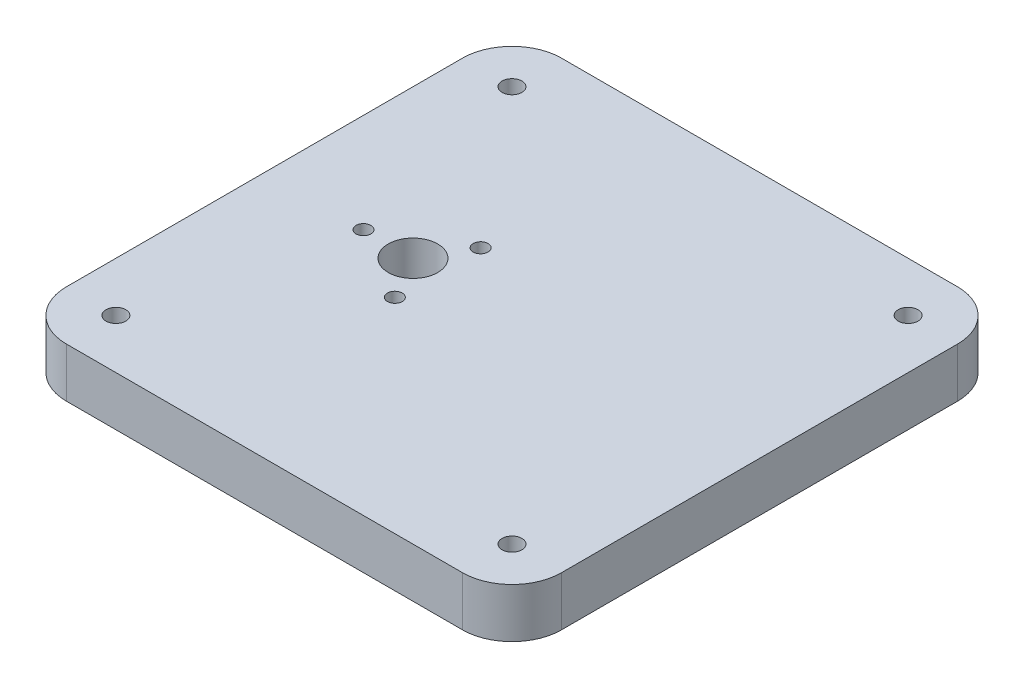
ISO-10303-21;
HEADER;
FILE_DESCRIPTION(('STEP AP214'),'2;1');
FILE_NAME('part.step','',(''),(''),'','','');
FILE_SCHEMA(('AUTOMOTIVE_DESIGN { 1 0 10303 214 1 1 1 1 }'));
ENDSEC;
DATA;
#1=APPLICATION_CONTEXT('core data for automotive mechanical design processes');
#2=APPLICATION_PROTOCOL_DEFINITION('international standard','automotive_design',2000,#1);
#3=PRODUCT_CONTEXT('',#1,'mechanical');
#4=PRODUCT('Part','Part','',(#3));
#5=PRODUCT_RELATED_PRODUCT_CATEGORY('part','',(#4));
#6=PRODUCT_DEFINITION_FORMATION('','',#4);
#7=PRODUCT_DEFINITION_CONTEXT('part definition',#1,'design');
#8=PRODUCT_DEFINITION('design','',#6,#7);
#9=PRODUCT_DEFINITION_SHAPE('','',#8);
#10=(LENGTH_UNIT() NAMED_UNIT(*) SI_UNIT(.MILLI.,.METRE.));
#11=(NAMED_UNIT(*) PLANE_ANGLE_UNIT() SI_UNIT($,.RADIAN.));
#12=(NAMED_UNIT(*) SI_UNIT($,.STERADIAN.) SOLID_ANGLE_UNIT());
#13=UNCERTAINTY_MEASURE_WITH_UNIT(LENGTH_MEASURE(1.E-05),#10,'distance_accuracy_value','');
#14=(GEOMETRIC_REPRESENTATION_CONTEXT(3) GLOBAL_UNCERTAINTY_ASSIGNED_CONTEXT((#13)) GLOBAL_UNIT_ASSIGNED_CONTEXT((#10,
#11,#12)) REPRESENTATION_CONTEXT('',''));
#15=CARTESIAN_POINT('',(0.,0.,0.));
#16=DIRECTION('',(0.,0.,1.));
#17=DIRECTION('',(1.,0.,0.));
#18=AXIS2_PLACEMENT_3D('',#15,#16,#17);
#19=CARTESIAN_POINT('',(-50.9375,10.,-24.9609375));
#20=DIRECTION('',(0.,-1.,0.));
#21=DIRECTION('',(0.,0.,-1.));
#22=AXIS2_PLACEMENT_3D('',#19,#20,#21);
#23=PLANE('',#22);
#24=CARTESIAN_POINT('',(-50.9375,10.,-24.9609375));
#25=DIRECTION('',(0.,1.,0.));
#26=DIRECTION('',(0.,0.,-1.));
#27=AXIS2_PLACEMENT_3D('',#24,#25,#26);
#28=CIRCLE('',#27,10.);
#29=CARTESIAN_POINT('',(-50.9375,10.,-34.9609375));
#30=VERTEX_POINT('',#29);
#31=CARTESIAN_POINT('',(-60.9375,10.,-24.9609375));
#32=VERTEX_POINT('',#31);
#33=EDGE_CURVE('E164',#30,#32,#28,.T.);
#34=ORIENTED_EDGE('',*,*,#33,.T.);
#35=DIRECTION('',(0.,0.,1.));
#36=VECTOR('',#35,1.);
#37=CARTESIAN_POINT('',(-60.9375,10.,-24.9609375));
#38=LINE('',#37,#36);
#39=CARTESIAN_POINT('',(-60.9375,10.,55.0390625));
#40=VERTEX_POINT('',#39);
#41=EDGE_CURVE('E100',#32,#40,#38,.T.);
#42=ORIENTED_EDGE('',*,*,#41,.T.);
#43=CARTESIAN_POINT('',(-50.9375,10.,55.0390625));
#44=DIRECTION('',(0.,1.,0.));
#45=DIRECTION('',(0.,0.,1.));
#46=AXIS2_PLACEMENT_3D('',#43,#44,#45);
#47=CIRCLE('',#46,10.);
#48=CARTESIAN_POINT('',(-50.9375,10.,65.0390625));
#49=VERTEX_POINT('',#48);
#50=EDGE_CURVE('E185',#40,#49,#47,.T.);
#51=ORIENTED_EDGE('',*,*,#50,.T.);
#52=DIRECTION('',(1.,0.,0.));
#53=VECTOR('',#52,1.);
#54=CARTESIAN_POINT('',(-50.9374999999999,10.,65.0390625));
#55=LINE('',#54,#53);
#56=CARTESIAN_POINT('',(29.0624999999999,10.,65.0390625));
#57=VERTEX_POINT('',#56);
#58=EDGE_CURVE('E199',#49,#57,#55,.T.);
#59=ORIENTED_EDGE('',*,*,#58,.T.);
#60=CARTESIAN_POINT('',(29.0625,10.,55.0390625));
#61=DIRECTION('',(0.,1.,0.));
#62=DIRECTION('',(0.,0.,1.));
#63=AXIS2_PLACEMENT_3D('',#60,#61,#62);
#64=CIRCLE('',#63,10.);
#65=CARTESIAN_POINT('',(39.0625,10.,55.0390625));
#66=VERTEX_POINT('',#65);
#67=EDGE_CURVE('E119',#57,#66,#64,.T.);
#68=ORIENTED_EDGE('',*,*,#67,.T.);
#69=DIRECTION('',(0.,0.,-1.));
#70=VECTOR('',#69,1.);
#71=CARTESIAN_POINT('',(39.0625,10.,-24.9609375));
#72=LINE('',#71,#70);
#73=CARTESIAN_POINT('',(39.0625,10.,-24.9609375));
#74=VERTEX_POINT('',#73);
#75=EDGE_CURVE('E113',#66,#74,#72,.T.);
#76=ORIENTED_EDGE('',*,*,#75,.T.);
#77=CARTESIAN_POINT('',(29.0625,10.,-24.9609375));
#78=DIRECTION('',(0.,1.,0.));
#79=DIRECTION('',(0.,0.,-1.));
#80=AXIS2_PLACEMENT_3D('',#77,#78,#79);
#81=CIRCLE('',#80,10.);
#82=CARTESIAN_POINT('',(29.0624999999999,10.,-34.9609375));
#83=VERTEX_POINT('',#82);
#84=EDGE_CURVE('E117',#74,#83,#81,.T.);
#85=ORIENTED_EDGE('',*,*,#84,.T.);
#86=DIRECTION('',(-1.,0.,0.));
#87=VECTOR('',#86,1.);
#88=CARTESIAN_POINT('',(-50.9375,10.,-34.9609375));
#89=LINE('',#88,#87);
#90=EDGE_CURVE('E57',#83,#30,#89,.T.);
#91=ORIENTED_EDGE('',*,*,#90,.T.);
#92=EDGE_LOOP('',(#34,#42,#51,#59,#68,#76,#85,#91));
#93=FACE_BOUND('',#92,.T.);
#94=CARTESIAN_POINT('',(-50.9375,10.,-24.9609375));
#95=DIRECTION('',(0.,1.,0.));
#96=DIRECTION('',(0.,0.,1.));
#97=AXIS2_PLACEMENT_3D('',#94,#95,#96);
#98=CIRCLE('',#97,2.);
#99=CARTESIAN_POINT('',(-50.9375,10.,-22.9609375));
#100=VERTEX_POINT('',#99);
#101=EDGE_CURVE('E146',#100,#100,#98,.T.);
#102=ORIENTED_EDGE('',*,*,#101,.F.);
#103=EDGE_LOOP('',(#102));
#104=FACE_BOUND('',#103,.T.);
#105=CARTESIAN_POINT('',(-50.9375,10.,55.0390625));
#106=DIRECTION('',(0.,1.,0.));
#107=DIRECTION('',(0.,0.,1.));
#108=AXIS2_PLACEMENT_3D('',#105,#106,#107);
#109=CIRCLE('',#108,2.);
#110=CARTESIAN_POINT('',(-50.9375,10.,57.0390625));
#111=VERTEX_POINT('',#110);
#112=EDGE_CURVE('E213',#111,#111,#109,.T.);
#113=ORIENTED_EDGE('',*,*,#112,.F.);
#114=EDGE_LOOP('',(#113));
#115=FACE_BOUND('',#114,.T.);
#116=CARTESIAN_POINT('',(29.0625,10.,-24.9609375));
#117=DIRECTION('',(0.,1.,0.));
#118=DIRECTION('',(0.,0.,1.));
#119=AXIS2_PLACEMENT_3D('',#116,#117,#118);
#120=CIRCLE('',#119,2.);
#121=CARTESIAN_POINT('',(29.0625,10.,-22.9609375));
#122=VERTEX_POINT('',#121);
#123=EDGE_CURVE('E221',#122,#122,#120,.T.);
#124=ORIENTED_EDGE('',*,*,#123,.F.);
#125=EDGE_LOOP('',(#124));
#126=FACE_BOUND('',#125,.T.);
#127=CARTESIAN_POINT('',(29.0625,10.,55.0390625));
#128=DIRECTION('',(0.,1.,0.));
#129=DIRECTION('',(0.,0.,1.));
#130=AXIS2_PLACEMENT_3D('',#127,#128,#129);
#131=CIRCLE('',#130,2.);
#132=CARTESIAN_POINT('',(29.0625,10.,57.0390625));
#133=VERTEX_POINT('',#132);
#134=EDGE_CURVE('E229',#133,#133,#131,.T.);
#135=ORIENTED_EDGE('',*,*,#134,.F.);
#136=EDGE_LOOP('',(#135));
#137=FACE_BOUND('',#136,.T.);
#138=CARTESIAN_POINT('',(-40.9375,10.,15.0390625));
#139=DIRECTION('',(0.,1.,0.));
#140=DIRECTION('',(0.,0.,1.));
#141=AXIS2_PLACEMENT_3D('',#138,#139,#140);
#142=CIRCLE('',#141,1.5);
#143=CARTESIAN_POINT('',(-40.9375,10.,16.5390625));
#144=VERTEX_POINT('',#143);
#145=EDGE_CURVE('E237',#144,#144,#142,.T.);
#146=ORIENTED_EDGE('',*,*,#145,.F.);
#147=EDGE_LOOP('',(#146));
#148=FACE_BOUND('',#147,.T.);
#149=CARTESIAN_POINT('',(-30.9375,10.,15.0390625));
#150=DIRECTION('',(0.,1.,0.));
#151=DIRECTION('',(0.,0.,1.));
#152=AXIS2_PLACEMENT_3D('',#149,#150,#151);
#153=CIRCLE('',#152,5.);
#154=CARTESIAN_POINT('',(-30.9375,10.,20.0390625));
#155=VERTEX_POINT('',#154);
#156=EDGE_CURVE('E245',#155,#155,#153,.T.);
#157=ORIENTED_EDGE('',*,*,#156,.F.);
#158=EDGE_LOOP('',(#157));
#159=FACE_BOUND('',#158,.T.);
#160=CARTESIAN_POINT('',(-25.9375,10.,23.6993165378444));
#161=DIRECTION('',(0.,1.,0.));
#162=DIRECTION('',(0.,0.,1.));
#163=AXIS2_PLACEMENT_3D('',#160,#161,#162);
#164=CIRCLE('',#163,1.5);
#165=CARTESIAN_POINT('',(-25.9375,10.,25.1993165378444));
#166=VERTEX_POINT('',#165);
#167=EDGE_CURVE('E253',#166,#166,#164,.T.);
#168=ORIENTED_EDGE('',*,*,#167,.F.);
#169=EDGE_LOOP('',(#168));
#170=FACE_BOUND('',#169,.T.);
#171=CARTESIAN_POINT('',(-25.9375,10.,6.37880846215558));
#172=DIRECTION('',(0.,1.,0.));
#173=DIRECTION('',(0.,0.,1.));
#174=AXIS2_PLACEMENT_3D('',#171,#172,#173);
#175=CIRCLE('',#174,1.5);
#176=CARTESIAN_POINT('',(-25.9375,10.,7.87880846215559));
#177=VERTEX_POINT('',#176);
#178=EDGE_CURVE('E261',#177,#177,#175,.T.);
#179=ORIENTED_EDGE('',*,*,#178,.F.);
#180=EDGE_LOOP('',(#179));
#181=FACE_BOUND('',#180,.T.);
#182=ADVANCED_FACE('F39',(#93,#104,#115,#126,#137,#148,#159,#170,#181),#23,.F.);
#183=CARTESIAN_POINT('',(-50.9375,0.,-24.9609375));
#184=DIRECTION('',(0.,-1.,0.));
#185=DIRECTION('',(0.,0.,-1.));
#186=AXIS2_PLACEMENT_3D('',#183,#184,#185);
#187=PLANE('',#186);
#188=CARTESIAN_POINT('',(-25.9375,0.,23.6993165378444));
#189=DIRECTION('',(0.,1.,0.));
#190=DIRECTION('',(0.,0.,1.));
#191=AXIS2_PLACEMENT_3D('',#188,#189,#190);
#192=CIRCLE('',#191,1.5);
#193=CARTESIAN_POINT('',(-25.9375,0.,25.1993165378444));
#194=VERTEX_POINT('',#193);
#195=EDGE_CURVE('E257',#194,#194,#192,.T.);
#196=ORIENTED_EDGE('',*,*,#195,.T.);
#197=EDGE_LOOP('',(#196));
#198=FACE_BOUND('',#197,.T.);
#199=CARTESIAN_POINT('',(-40.9375,0.,15.0390625));
#200=DIRECTION('',(0.,1.,0.));
#201=DIRECTION('',(0.,0.,1.));
#202=AXIS2_PLACEMENT_3D('',#199,#200,#201);
#203=CIRCLE('',#202,1.5);
#204=CARTESIAN_POINT('',(-40.9375,0.,16.5390625));
#205=VERTEX_POINT('',#204);
#206=EDGE_CURVE('E241',#205,#205,#203,.T.);
#207=ORIENTED_EDGE('',*,*,#206,.T.);
#208=EDGE_LOOP('',(#207));
#209=FACE_BOUND('',#208,.T.);
#210=CARTESIAN_POINT('',(29.0625,0.,-24.9609375));
#211=DIRECTION('',(0.,1.,0.));
#212=DIRECTION('',(0.,0.,1.));
#213=AXIS2_PLACEMENT_3D('',#210,#211,#212);
#214=CIRCLE('',#213,2.);
#215=CARTESIAN_POINT('',(29.0625,0.,-22.9609375));
#216=VERTEX_POINT('',#215);
#217=EDGE_CURVE('E225',#216,#216,#214,.T.);
#218=ORIENTED_EDGE('',*,*,#217,.T.);
#219=EDGE_LOOP('',(#218));
#220=FACE_BOUND('',#219,.T.);
#221=CARTESIAN_POINT('',(-50.9375,0.,-24.9609375));
#222=DIRECTION('',(0.,1.,0.));
#223=DIRECTION('',(0.,0.,1.));
#224=AXIS2_PLACEMENT_3D('',#221,#222,#223);
#225=CIRCLE('',#224,2.);
#226=CARTESIAN_POINT('',(-50.9375,0.,-22.9609375));
#227=VERTEX_POINT('',#226);
#228=EDGE_CURVE('E209',#227,#227,#225,.T.);
#229=ORIENTED_EDGE('',*,*,#228,.T.);
#230=EDGE_LOOP('',(#229));
#231=FACE_BOUND('',#230,.T.);
#232=CARTESIAN_POINT('',(-50.9375,0.,-24.9609375));
#233=DIRECTION('',(0.,1.,0.));
#234=DIRECTION('',(0.,0.,-1.));
#235=AXIS2_PLACEMENT_3D('',#232,#233,#234);
#236=CIRCLE('',#235,10.);
#237=CARTESIAN_POINT('',(-50.9375,0.,-34.9609375));
#238=VERTEX_POINT('',#237);
#239=CARTESIAN_POINT('',(-60.9375,0.,-24.9609375));
#240=VERTEX_POINT('',#239);
#241=EDGE_CURVE('E141',#238,#240,#236,.T.);
#242=ORIENTED_EDGE('',*,*,#241,.F.);
#243=DIRECTION('',(-1.,0.,0.));
#244=VECTOR('',#243,1.);
#245=CARTESIAN_POINT('',(-50.9375,0.,-34.9609375));
#246=LINE('',#245,#244);
#247=CARTESIAN_POINT('',(29.0624999999999,0.,-34.9609375));
#248=VERTEX_POINT('',#247);
#249=EDGE_CURVE('E92',#248,#238,#246,.T.);
#250=ORIENTED_EDGE('',*,*,#249,.F.);
#251=CARTESIAN_POINT('',(29.0625,0.,-24.9609375));
#252=DIRECTION('',(0.,1.,0.));
#253=DIRECTION('',(0.,0.,-1.));
#254=AXIS2_PLACEMENT_3D('',#251,#252,#253);
#255=CIRCLE('',#254,10.);
#256=CARTESIAN_POINT('',(39.0625,0.,-24.9609375));
#257=VERTEX_POINT('',#256);
#258=EDGE_CURVE('E86',#257,#248,#255,.T.);
#259=ORIENTED_EDGE('',*,*,#258,.F.);
#260=DIRECTION('',(0.,0.,-1.));
#261=VECTOR('',#260,1.);
#262=CARTESIAN_POINT('',(39.0625,0.,-24.9609375));
#263=LINE('',#262,#261);
#264=CARTESIAN_POINT('',(39.0625,0.,55.0390625));
#265=VERTEX_POINT('',#264);
#266=EDGE_CURVE('E128',#265,#257,#263,.T.);
#267=ORIENTED_EDGE('',*,*,#266,.F.);
#268=CARTESIAN_POINT('',(29.0625,0.,55.0390625));
#269=DIRECTION('',(0.,1.,0.));
#270=DIRECTION('',(0.,0.,1.));
#271=AXIS2_PLACEMENT_3D('',#268,#269,#270);
#272=CIRCLE('',#271,10.);
#273=CARTESIAN_POINT('',(29.0624999999999,0.,65.0390625));
#274=VERTEX_POINT('',#273);
#275=EDGE_CURVE('E155',#274,#265,#272,.T.);
#276=ORIENTED_EDGE('',*,*,#275,.F.);
#277=DIRECTION('',(1.,0.,0.));
#278=VECTOR('',#277,1.);
#279=CARTESIAN_POINT('',(-50.9374999999999,0.,65.0390625));
#280=LINE('',#279,#278);
#281=CARTESIAN_POINT('',(-50.9375,0.,65.0390625));
#282=VERTEX_POINT('',#281);
#283=EDGE_CURVE('E152',#282,#274,#280,.T.);
#284=ORIENTED_EDGE('',*,*,#283,.F.);
#285=CARTESIAN_POINT('',(-50.9375,0.,55.0390625));
#286=DIRECTION('',(0.,1.,0.));
#287=DIRECTION('',(0.,0.,1.));
#288=AXIS2_PLACEMENT_3D('',#285,#286,#287);
#289=CIRCLE('',#288,10.);
#290=CARTESIAN_POINT('',(-60.9375,0.,55.0390625));
#291=VERTEX_POINT('',#290);
#292=EDGE_CURVE('E149',#291,#282,#289,.T.);
#293=ORIENTED_EDGE('',*,*,#292,.F.);
#294=DIRECTION('',(0.,0.,1.));
#295=VECTOR('',#294,1.);
#296=CARTESIAN_POINT('',(-60.9375,0.,-24.9609375));
#297=LINE('',#296,#295);
#298=EDGE_CURVE('E145',#240,#291,#297,.T.);
#299=ORIENTED_EDGE('',*,*,#298,.F.);
#300=EDGE_LOOP('',(#242,#250,#259,#267,#276,#284,#293,#299));
#301=FACE_BOUND('',#300,.T.);
#302=CARTESIAN_POINT('',(-50.9375,0.,55.0390625));
#303=DIRECTION('',(0.,1.,0.));
#304=DIRECTION('',(0.,0.,1.));
#305=AXIS2_PLACEMENT_3D('',#302,#303,#304);
#306=CIRCLE('',#305,2.);
#307=CARTESIAN_POINT('',(-50.9375,0.,57.0390625));
#308=VERTEX_POINT('',#307);
#309=EDGE_CURVE('E217',#308,#308,#306,.T.);
#310=ORIENTED_EDGE('',*,*,#309,.T.);
#311=EDGE_LOOP('',(#310));
#312=FACE_BOUND('',#311,.T.);
#313=CARTESIAN_POINT('',(29.0625,0.,55.0390625));
#314=DIRECTION('',(0.,1.,0.));
#315=DIRECTION('',(0.,0.,1.));
#316=AXIS2_PLACEMENT_3D('',#313,#314,#315);
#317=CIRCLE('',#316,2.);
#318=CARTESIAN_POINT('',(29.0625,0.,57.0390625));
#319=VERTEX_POINT('',#318);
#320=EDGE_CURVE('E233',#319,#319,#317,.T.);
#321=ORIENTED_EDGE('',*,*,#320,.T.);
#322=EDGE_LOOP('',(#321));
#323=FACE_BOUND('',#322,.T.);
#324=CARTESIAN_POINT('',(-30.9375,0.,15.0390625));
#325=DIRECTION('',(0.,1.,0.));
#326=DIRECTION('',(0.,0.,1.));
#327=AXIS2_PLACEMENT_3D('',#324,#325,#326);
#328=CIRCLE('',#327,5.);
#329=CARTESIAN_POINT('',(-30.9375,0.,20.0390625));
#330=VERTEX_POINT('',#329);
#331=EDGE_CURVE('E249',#330,#330,#328,.T.);
#332=ORIENTED_EDGE('',*,*,#331,.T.);
#333=EDGE_LOOP('',(#332));
#334=FACE_BOUND('',#333,.T.);
#335=CARTESIAN_POINT('',(-25.9375,0.,6.37880846215558));
#336=DIRECTION('',(0.,1.,0.));
#337=DIRECTION('',(0.,0.,1.));
#338=AXIS2_PLACEMENT_3D('',#335,#336,#337);
#339=CIRCLE('',#338,1.5);
#340=CARTESIAN_POINT('',(-25.9375,0.,7.87880846215559));
#341=VERTEX_POINT('',#340);
#342=EDGE_CURVE('E265',#341,#341,#339,.T.);
#343=ORIENTED_EDGE('',*,*,#342,.T.);
#344=EDGE_LOOP('',(#343));
#345=FACE_BOUND('',#344,.T.);
#346=ADVANCED_FACE('F189',(#198,#209,#220,#231,#301,#312,#323,#334,#345),#187,.T.);
#347=CARTESIAN_POINT('',(-50.9375,10.,-24.9609375));
#348=DIRECTION('',(0.,-1.,0.));
#349=DIRECTION('',(0.,0.,-1.));
#350=AXIS2_PLACEMENT_3D('',#347,#348,#349);
#351=CYLINDRICAL_SURFACE('',#350,10.);
#352=ORIENTED_EDGE('',*,*,#241,.T.);
#353=DIRECTION('',(0.,-1.,0.));
#354=VECTOR('',#353,1.);
#355=CARTESIAN_POINT('',(-60.9375,10.,-24.9609375));
#356=LINE('',#355,#354);
#357=EDGE_CURVE('E11',#32,#240,#356,.T.);
#358=ORIENTED_EDGE('',*,*,#357,.F.);
#359=ORIENTED_EDGE('',*,*,#33,.F.);
#360=DIRECTION('',(0.,-1.,0.));
#361=VECTOR('',#360,1.);
#362=CARTESIAN_POINT('',(-50.9375,10.,-34.9609375));
#363=LINE('',#362,#361);
#364=EDGE_CURVE('E137',#30,#238,#363,.T.);
#365=ORIENTED_EDGE('',*,*,#364,.T.);
#366=EDGE_LOOP('',(#352,#358,#359,#365));
#367=FACE_BOUND('',#366,.T.);
#368=ADVANCED_FACE('F41',(#367),#351,.T.);
#369=CARTESIAN_POINT('',(-60.9375,10.,-24.9609375));
#370=DIRECTION('',(1.,0.,0.));
#371=DIRECTION('',(0.,0.,-1.));
#372=AXIS2_PLACEMENT_3D('',#369,#370,#371);
#373=PLANE('',#372);
#374=ORIENTED_EDGE('',*,*,#298,.T.);
#375=DIRECTION('',(0.,-1.,0.));
#376=VECTOR('',#375,1.);
#377=CARTESIAN_POINT('',(-60.9375,10.,55.0390625));
#378=LINE('',#377,#376);
#379=EDGE_CURVE('E49',#40,#291,#378,.T.);
#380=ORIENTED_EDGE('',*,*,#379,.F.);
#381=ORIENTED_EDGE('',*,*,#41,.F.);
#382=ORIENTED_EDGE('',*,*,#357,.T.);
#383=EDGE_LOOP('',(#374,#380,#381,#382));
#384=FACE_BOUND('',#383,.T.);
#385=ADVANCED_FACE('F299',(#384),#373,.F.);
#386=CARTESIAN_POINT('',(-50.9375,10.,55.0390625));
#387=DIRECTION('',(0.,-1.,0.));
#388=DIRECTION('',(0.,0.,-1.));
#389=AXIS2_PLACEMENT_3D('',#386,#387,#388);
#390=CYLINDRICAL_SURFACE('',#389,10.);
#391=ORIENTED_EDGE('',*,*,#292,.T.);
#392=DIRECTION('',(0.,-1.,0.));
#393=VECTOR('',#392,1.);
#394=CARTESIAN_POINT('',(-50.9375,10.,65.0390625));
#395=LINE('',#394,#393);
#396=EDGE_CURVE('E175',#49,#282,#395,.T.);
#397=ORIENTED_EDGE('',*,*,#396,.F.);
#398=ORIENTED_EDGE('',*,*,#50,.F.);
#399=ORIENTED_EDGE('',*,*,#379,.T.);
#400=EDGE_LOOP('',(#391,#397,#398,#399));
#401=FACE_BOUND('',#400,.T.);
#402=ADVANCED_FACE('F183',(#401),#390,.T.);
#403=CARTESIAN_POINT('',(-50.9374999999999,10.,65.0390625));
#404=DIRECTION('',(0.,0.,-1.));
#405=DIRECTION('',(-1.,0.,0.));
#406=AXIS2_PLACEMENT_3D('',#403,#404,#405);
#407=PLANE('',#406);
#408=ORIENTED_EDGE('',*,*,#283,.T.);
#409=DIRECTION('',(0.,-1.,0.));
#410=VECTOR('',#409,1.);
#411=CARTESIAN_POINT('',(29.0624999999999,10.,65.0390625));
#412=LINE('',#411,#410);
#413=EDGE_CURVE('E171',#57,#274,#412,.T.);
#414=ORIENTED_EDGE('',*,*,#413,.F.);
#415=ORIENTED_EDGE('',*,*,#58,.F.);
#416=ORIENTED_EDGE('',*,*,#396,.T.);
#417=EDGE_LOOP('',(#408,#414,#415,#416));
#418=FACE_BOUND('',#417,.T.);
#419=ADVANCED_FACE('F194',(#418),#407,.F.);
#420=CARTESIAN_POINT('',(29.0625,10.,55.0390625));
#421=DIRECTION('',(0.,-1.,0.));
#422=DIRECTION('',(0.,0.,-1.));
#423=AXIS2_PLACEMENT_3D('',#420,#421,#422);
#424=CYLINDRICAL_SURFACE('',#423,10.);
#425=ORIENTED_EDGE('',*,*,#275,.T.);
#426=DIRECTION('',(0.,-1.,0.));
#427=VECTOR('',#426,1.);
#428=CARTESIAN_POINT('',(39.0625,10.,55.0390625));
#429=LINE('',#428,#427);
#430=EDGE_CURVE('E130',#66,#265,#429,.T.);
#431=ORIENTED_EDGE('',*,*,#430,.F.);
#432=ORIENTED_EDGE('',*,*,#67,.F.);
#433=ORIENTED_EDGE('',*,*,#413,.T.);
#434=EDGE_LOOP('',(#425,#431,#432,#433));
#435=FACE_BOUND('',#434,.T.);
#436=ADVANCED_FACE('F197',(#435),#424,.T.);
#437=CARTESIAN_POINT('',(39.0625,10.,-24.9609375));
#438=DIRECTION('',(-1.,0.,0.));
#439=DIRECTION('',(0.,0.,1.));
#440=AXIS2_PLACEMENT_3D('',#437,#438,#439);
#441=PLANE('',#440);
#442=ORIENTED_EDGE('',*,*,#266,.T.);
#443=DIRECTION('',(0.,-1.,0.));
#444=VECTOR('',#443,1.);
#445=CARTESIAN_POINT('',(39.0625,10.,-24.9609375));
#446=LINE('',#445,#444);
#447=EDGE_CURVE('E125',#74,#257,#446,.T.);
#448=ORIENTED_EDGE('',*,*,#447,.F.);
#449=ORIENTED_EDGE('',*,*,#75,.F.);
#450=ORIENTED_EDGE('',*,*,#430,.T.);
#451=EDGE_LOOP('',(#442,#448,#449,#450));
#452=FACE_BOUND('',#451,.T.);
#453=ADVANCED_FACE('F126',(#452),#441,.F.);
#454=CARTESIAN_POINT('',(29.0625,10.,-24.9609375));
#455=DIRECTION('',(0.,-1.,0.));
#456=DIRECTION('',(0.,0.,-1.));
#457=AXIS2_PLACEMENT_3D('',#454,#455,#456);
#458=CYLINDRICAL_SURFACE('',#457,10.);
#459=ORIENTED_EDGE('',*,*,#258,.T.);
#460=DIRECTION('',(0.,-1.,0.));
#461=VECTOR('',#460,1.);
#462=CARTESIAN_POINT('',(29.0624999999999,10.,-34.9609375));
#463=LINE('',#462,#461);
#464=EDGE_CURVE('E131',#83,#248,#463,.T.);
#465=ORIENTED_EDGE('',*,*,#464,.F.);
#466=ORIENTED_EDGE('',*,*,#84,.F.);
#467=ORIENTED_EDGE('',*,*,#447,.T.);
#468=EDGE_LOOP('',(#459,#465,#466,#467));
#469=FACE_BOUND('',#468,.T.);
#470=ADVANCED_FACE('F133',(#469),#458,.T.);
#471=CARTESIAN_POINT('',(-50.9375,10.,-34.9609375));
#472=DIRECTION('',(0.,0.,1.));
#473=DIRECTION('',(1.,0.,0.));
#474=AXIS2_PLACEMENT_3D('',#471,#472,#473);
#475=PLANE('',#474);
#476=ORIENTED_EDGE('',*,*,#249,.T.);
#477=ORIENTED_EDGE('',*,*,#364,.F.);
#478=ORIENTED_EDGE('',*,*,#90,.F.);
#479=ORIENTED_EDGE('',*,*,#464,.T.);
#480=EDGE_LOOP('',(#476,#477,#478,#479));
#481=FACE_BOUND('',#480,.T.);
#482=ADVANCED_FACE('F287',(#481),#475,.F.);
#483=CARTESIAN_POINT('',(-50.9375,10.,-24.9609375));
#484=DIRECTION('',(0.,-1.,0.));
#485=DIRECTION('',(0.,0.,-1.));
#486=AXIS2_PLACEMENT_3D('',#483,#484,#485);
#487=CYLINDRICAL_SURFACE('',#486,2.);
#488=ORIENTED_EDGE('',*,*,#101,.T.);
#489=EDGE_LOOP('',(#488));
#490=FACE_BOUND('',#489,.T.);
#491=ORIENTED_EDGE('',*,*,#228,.F.);
#492=EDGE_LOOP('',(#491));
#493=FACE_BOUND('',#492,.T.);
#494=ADVANCED_FACE('F284',(#490,#493),#487,.F.);
#495=CARTESIAN_POINT('',(-50.9375,10.,55.0390625));
#496=DIRECTION('',(0.,-1.,0.));
#497=DIRECTION('',(0.,0.,-1.));
#498=AXIS2_PLACEMENT_3D('',#495,#496,#497);
#499=CYLINDRICAL_SURFACE('',#498,2.);
#500=ORIENTED_EDGE('',*,*,#112,.T.);
#501=EDGE_LOOP('',(#500));
#502=FACE_BOUND('',#501,.T.);
#503=ORIENTED_EDGE('',*,*,#309,.F.);
#504=EDGE_LOOP('',(#503));
#505=FACE_BOUND('',#504,.T.);
#506=ADVANCED_FACE('F363',(#502,#505),#499,.F.);
#507=CARTESIAN_POINT('',(29.0625,10.,-24.9609375));
#508=DIRECTION('',(0.,-1.,0.));
#509=DIRECTION('',(0.,0.,-1.));
#510=AXIS2_PLACEMENT_3D('',#507,#508,#509);
#511=CYLINDRICAL_SURFACE('',#510,2.);
#512=ORIENTED_EDGE('',*,*,#123,.T.);
#513=EDGE_LOOP('',(#512));
#514=FACE_BOUND('',#513,.T.);
#515=ORIENTED_EDGE('',*,*,#217,.F.);
#516=EDGE_LOOP('',(#515));
#517=FACE_BOUND('',#516,.T.);
#518=ADVANCED_FACE('F371',(#514,#517),#511,.F.);
#519=CARTESIAN_POINT('',(29.0625,10.,55.0390625));
#520=DIRECTION('',(0.,-1.,0.));
#521=DIRECTION('',(0.,0.,-1.));
#522=AXIS2_PLACEMENT_3D('',#519,#520,#521);
#523=CYLINDRICAL_SURFACE('',#522,2.);
#524=ORIENTED_EDGE('',*,*,#134,.T.);
#525=EDGE_LOOP('',(#524));
#526=FACE_BOUND('',#525,.T.);
#527=ORIENTED_EDGE('',*,*,#320,.F.);
#528=EDGE_LOOP('',(#527));
#529=FACE_BOUND('',#528,.T.);
#530=ADVANCED_FACE('F379',(#526,#529),#523,.F.);
#531=CARTESIAN_POINT('',(-40.9375,10.,15.0390625));
#532=DIRECTION('',(0.,-1.,0.));
#533=DIRECTION('',(0.,0.,-1.));
#534=AXIS2_PLACEMENT_3D('',#531,#532,#533);
#535=CYLINDRICAL_SURFACE('',#534,1.5);
#536=ORIENTED_EDGE('',*,*,#145,.T.);
#537=EDGE_LOOP('',(#536));
#538=FACE_BOUND('',#537,.T.);
#539=ORIENTED_EDGE('',*,*,#206,.F.);
#540=EDGE_LOOP('',(#539));
#541=FACE_BOUND('',#540,.T.);
#542=ADVANCED_FACE('F388',(#538,#541),#535,.F.);
#543=CARTESIAN_POINT('',(-30.9375,10.,15.0390625));
#544=DIRECTION('',(0.,-1.,0.));
#545=DIRECTION('',(0.,0.,-1.));
#546=AXIS2_PLACEMENT_3D('',#543,#544,#545);
#547=CYLINDRICAL_SURFACE('',#546,5.);
#548=ORIENTED_EDGE('',*,*,#156,.T.);
#549=EDGE_LOOP('',(#548));
#550=FACE_BOUND('',#549,.T.);
#551=ORIENTED_EDGE('',*,*,#331,.F.);
#552=EDGE_LOOP('',(#551));
#553=FACE_BOUND('',#552,.T.);
#554=ADVANCED_FACE('F397',(#550,#553),#547,.F.);
#555=CARTESIAN_POINT('',(-25.9375,10.,23.6993165378444));
#556=DIRECTION('',(0.,-1.,0.));
#557=DIRECTION('',(0.,0.,-1.));
#558=AXIS2_PLACEMENT_3D('',#555,#556,#557);
#559=CYLINDRICAL_SURFACE('',#558,1.5);
#560=ORIENTED_EDGE('',*,*,#167,.T.);
#561=EDGE_LOOP('',(#560));
#562=FACE_BOUND('',#561,.T.);
#563=ORIENTED_EDGE('',*,*,#195,.F.);
#564=EDGE_LOOP('',(#563));
#565=FACE_BOUND('',#564,.T.);
#566=ADVANCED_FACE('F406',(#562,#565),#559,.F.);
#567=CARTESIAN_POINT('',(-25.9375,10.,6.37880846215558));
#568=DIRECTION('',(0.,-1.,0.));
#569=DIRECTION('',(0.,0.,-1.));
#570=AXIS2_PLACEMENT_3D('',#567,#568,#569);
#571=CYLINDRICAL_SURFACE('',#570,1.5);
#572=ORIENTED_EDGE('',*,*,#178,.T.);
#573=EDGE_LOOP('',(#572));
#574=FACE_BOUND('',#573,.T.);
#575=ORIENTED_EDGE('',*,*,#342,.F.);
#576=EDGE_LOOP('',(#575));
#577=FACE_BOUND('',#576,.T.);
#578=ADVANCED_FACE('F273',(#574,#577),#571,.F.);
#579=CLOSED_SHELL('',(#182,#346,#368,#385,#402,#419,#436,#453,#470,#482,#494,#506,#518,#530,
#542,#554,#566,#578));
#580=MANIFOLD_SOLID_BREP('B2',#579);
#581=ADVANCED_BREP_SHAPE_REPRESENTATION('',(#18,#580),#14);
#582=SHAPE_DEFINITION_REPRESENTATION(#9,#581);
ENDSEC;
END-ISO-10303-21;
